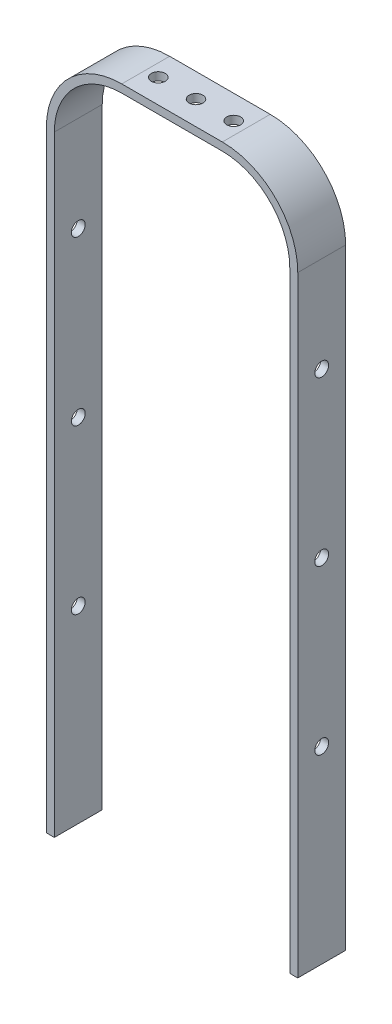
ISO-10303-21;
HEADER;
FILE_DESCRIPTION(('STEP AP214'),'2;1');
FILE_NAME('part.step','',(''),(''),'','','');
FILE_SCHEMA(('AUTOMOTIVE_DESIGN { 1 0 10303 214 1 1 1 1 }'));
ENDSEC;
DATA;
#1=APPLICATION_CONTEXT('core data for automotive mechanical design processes');
#2=APPLICATION_PROTOCOL_DEFINITION('international standard','automotive_design',2000,#1);
#3=PRODUCT_CONTEXT('',#1,'mechanical');
#4=PRODUCT('Part','Part','',(#3));
#5=PRODUCT_RELATED_PRODUCT_CATEGORY('part','',(#4));
#6=PRODUCT_DEFINITION_FORMATION('','',#4);
#7=PRODUCT_DEFINITION_CONTEXT('part definition',#1,'design');
#8=PRODUCT_DEFINITION('design','',#6,#7);
#9=PRODUCT_DEFINITION_SHAPE('','',#8);
#10=(LENGTH_UNIT() NAMED_UNIT(*) SI_UNIT(.MILLI.,.METRE.));
#11=(NAMED_UNIT(*) PLANE_ANGLE_UNIT() SI_UNIT($,.RADIAN.));
#12=(NAMED_UNIT(*) SI_UNIT($,.STERADIAN.) SOLID_ANGLE_UNIT());
#13=UNCERTAINTY_MEASURE_WITH_UNIT(LENGTH_MEASURE(1.E-05),#10,'distance_accuracy_value','');
#14=(GEOMETRIC_REPRESENTATION_CONTEXT(3) GLOBAL_UNCERTAINTY_ASSIGNED_CONTEXT((#13)) GLOBAL_UNIT_ASSIGNED_CONTEXT((#10,
#11,#12)) REPRESENTATION_CONTEXT('',''));
#15=CARTESIAN_POINT('',(0.,0.,0.));
#16=DIRECTION('',(0.,0.,1.));
#17=DIRECTION('',(1.,0.,0.));
#18=AXIS2_PLACEMENT_3D('',#15,#16,#17);
#19=CARTESIAN_POINT('',(46.825,0.,9.525));
#20=DIRECTION('',(0.,1.,0.));
#21=DIRECTION('',(-1.,0.,0.));
#22=AXIS2_PLACEMENT_3D('',#19,#20,#21);
#23=PLANE('',#22);
#24=DIRECTION('',(1.,0.,0.));
#25=VECTOR('',#24,1.);
#26=CARTESIAN_POINT('',(46.825,0.,-9.525));
#27=LINE('',#26,#25);
#28=CARTESIAN_POINT('',(46.825,0.,-9.525));
#29=VERTEX_POINT('',#28);
#30=CARTESIAN_POINT('',(50.,0.,-9.525));
#31=VERTEX_POINT('',#30);
#32=EDGE_CURVE('E157',#29,#31,#27,.T.);
#33=ORIENTED_EDGE('',*,*,#32,.T.);
#34=DIRECTION('',(0.,0.,-1.));
#35=VECTOR('',#34,1.);
#36=CARTESIAN_POINT('',(50.,0.,9.525));
#37=LINE('',#36,#35);
#38=CARTESIAN_POINT('',(50.,0.,9.525));
#39=VERTEX_POINT('',#38);
#40=EDGE_CURVE('E11',#39,#31,#37,.T.);
#41=ORIENTED_EDGE('',*,*,#40,.F.);
#42=DIRECTION('',(1.,0.,0.));
#43=VECTOR('',#42,1.);
#44=CARTESIAN_POINT('',(46.825,0.,9.525));
#45=LINE('',#44,#43);
#46=CARTESIAN_POINT('',(46.825,0.,9.525));
#47=VERTEX_POINT('',#46);
#48=EDGE_CURVE('E180',#47,#39,#45,.T.);
#49=ORIENTED_EDGE('',*,*,#48,.F.);
#50=DIRECTION('',(0.,0.,-1.));
#51=VECTOR('',#50,1.);
#52=CARTESIAN_POINT('',(46.825,0.,9.525));
#53=LINE('',#52,#51);
#54=EDGE_CURVE('E153',#47,#29,#53,.T.);
#55=ORIENTED_EDGE('',*,*,#54,.T.);
#56=EDGE_LOOP('',(#33,#41,#49,#55));
#57=FACE_BOUND('',#56,.T.);
#58=ADVANCED_FACE('F35',(#57),#23,.F.);
#59=CARTESIAN_POINT('',(50.,0.,9.525));
#60=DIRECTION('',(-1.,0.,0.));
#61=DIRECTION('',(0.,0.,1.));
#62=AXIS2_PLACEMENT_3D('',#59,#60,#61);
#63=PLANE('',#62);
#64=CARTESIAN_POINT('',(50.,205.,0.));
#65=DIRECTION('',(-1.,0.,0.));
#66=DIRECTION('',(0.,0.,1.));
#67=AXIS2_PLACEMENT_3D('',#64,#65,#66);
#68=CIRCLE('',#67,2.75);
#69=CARTESIAN_POINT('',(50.,205.,-2.75000000000001));
#70=VERTEX_POINT('',#69);
#71=EDGE_CURVE('E239',#70,#70,#68,.T.);
#72=ORIENTED_EDGE('',*,*,#71,.T.);
#73=EDGE_LOOP('',(#72));
#74=FACE_BOUND('',#73,.T.);
#75=CARTESIAN_POINT('',(50.,140.,0.));
#76=DIRECTION('',(-1.,0.,0.));
#77=DIRECTION('',(0.,0.,1.));
#78=AXIS2_PLACEMENT_3D('',#75,#76,#77);
#79=CIRCLE('',#78,2.75);
#80=CARTESIAN_POINT('',(50.,140.,-2.75000000000001));
#81=VERTEX_POINT('',#80);
#82=EDGE_CURVE('E224',#81,#81,#79,.T.);
#83=ORIENTED_EDGE('',*,*,#82,.T.);
#84=EDGE_LOOP('',(#83));
#85=FACE_BOUND('',#84,.T.);
#86=CARTESIAN_POINT('',(50.,75.,0.));
#87=DIRECTION('',(-1.,0.,0.));
#88=DIRECTION('',(0.,0.,1.));
#89=AXIS2_PLACEMENT_3D('',#86,#87,#88);
#90=CIRCLE('',#89,2.75);
#91=CARTESIAN_POINT('',(50.,75.,-2.75000000000002));
#92=VERTEX_POINT('',#91);
#93=EDGE_CURVE('E220',#92,#92,#90,.T.);
#94=ORIENTED_EDGE('',*,*,#93,.T.);
#95=EDGE_LOOP('',(#94));
#96=FACE_BOUND('',#95,.T.);
#97=DIRECTION('',(0.,1.,0.));
#98=VECTOR('',#97,1.);
#99=CARTESIAN_POINT('',(50.,0.,-9.525));
#100=LINE('',#99,#98);
#101=CARTESIAN_POINT('',(50.,243.,-9.525));
#102=VERTEX_POINT('',#101);
#103=EDGE_CURVE('E160',#31,#102,#100,.T.);
#104=ORIENTED_EDGE('',*,*,#103,.T.);
#105=DIRECTION('',(0.,0.,-1.));
#106=VECTOR('',#105,1.);
#107=CARTESIAN_POINT('',(50.,243.,9.525));
#108=LINE('',#107,#106);
#109=CARTESIAN_POINT('',(50.,243.,9.525));
#110=VERTEX_POINT('',#109);
#111=EDGE_CURVE('E44',#110,#102,#108,.T.);
#112=ORIENTED_EDGE('',*,*,#111,.F.);
#113=DIRECTION('',(0.,1.,0.));
#114=VECTOR('',#113,1.);
#115=CARTESIAN_POINT('',(50.,0.,9.525));
#116=LINE('',#115,#114);
#117=EDGE_CURVE('E108',#39,#110,#116,.T.);
#118=ORIENTED_EDGE('',*,*,#117,.F.);
#119=ORIENTED_EDGE('',*,*,#40,.T.);
#120=EDGE_LOOP('',(#104,#112,#118,#119));
#121=FACE_BOUND('',#120,.T.);
#122=ADVANCED_FACE('F295',(#74,#85,#96,#121),#63,.F.);
#123=CARTESIAN_POINT('',(20.,243.,9.525));
#124=DIRECTION('',(0.,0.,-1.));
#125=DIRECTION('',(-1.,0.,0.));
#126=AXIS2_PLACEMENT_3D('',#123,#124,#125);
#127=CYLINDRICAL_SURFACE('',#126,30.);
#128=CARTESIAN_POINT('',(20.,243.,-9.525));
#129=DIRECTION('',(0.,0.,1.));
#130=DIRECTION('',(1.,0.,0.));
#131=AXIS2_PLACEMENT_3D('',#128,#129,#130);
#132=CIRCLE('',#131,30.);
#133=CARTESIAN_POINT('',(20.,273.,-9.525));
#134=VERTEX_POINT('',#133);
#135=EDGE_CURVE('E163',#102,#134,#132,.T.);
#136=ORIENTED_EDGE('',*,*,#135,.T.);
#137=DIRECTION('',(0.,0.,-1.));
#138=VECTOR('',#137,1.);
#139=CARTESIAN_POINT('',(20.,273.,9.525));
#140=LINE('',#139,#138);
#141=CARTESIAN_POINT('',(20.,273.,9.525));
#142=VERTEX_POINT('',#141);
#143=EDGE_CURVE('E199',#142,#134,#140,.T.);
#144=ORIENTED_EDGE('',*,*,#143,.F.);
#145=CARTESIAN_POINT('',(20.,243.,9.525));
#146=DIRECTION('',(0.,0.,1.));
#147=DIRECTION('',(1.,0.,0.));
#148=AXIS2_PLACEMENT_3D('',#145,#146,#147);
#149=CIRCLE('',#148,30.);
#150=EDGE_CURVE('E252',#110,#142,#149,.T.);
#151=ORIENTED_EDGE('',*,*,#150,.F.);
#152=ORIENTED_EDGE('',*,*,#111,.T.);
#153=EDGE_LOOP('',(#136,#144,#151,#152));
#154=FACE_BOUND('',#153,.T.);
#155=ADVANCED_FACE('F300',(#154),#127,.T.);
#156=CARTESIAN_POINT('',(20.,273.,9.525));
#157=DIRECTION('',(0.,-1.,0.));
#158=DIRECTION('',(0.,0.,-1.));
#159=AXIS2_PLACEMENT_3D('',#156,#157,#158);
#160=PLANE('',#159);
#161=CARTESIAN_POINT('',(15.,273.,0.));
#162=DIRECTION('',(0.,1.,0.));
#163=DIRECTION('',(0.,0.,1.));
#164=AXIS2_PLACEMENT_3D('',#161,#162,#163);
#165=CIRCLE('',#164,2.75);
#166=CARTESIAN_POINT('',(15.,273.,2.75));
#167=VERTEX_POINT('',#166);
#168=EDGE_CURVE('E242',#167,#167,#165,.T.);
#169=ORIENTED_EDGE('',*,*,#168,.F.);
#170=EDGE_LOOP('',(#169));
#171=FACE_BOUND('',#170,.T.);
#172=CARTESIAN_POINT('',(-15.,273.,0.));
#173=DIRECTION('',(0.,1.,0.));
#174=DIRECTION('',(0.,0.,1.));
#175=AXIS2_PLACEMENT_3D('',#172,#173,#174);
#176=CIRCLE('',#175,2.75);
#177=CARTESIAN_POINT('',(-15.,273.,2.75));
#178=VERTEX_POINT('',#177);
#179=EDGE_CURVE('E243',#178,#178,#176,.T.);
#180=ORIENTED_EDGE('',*,*,#179,.F.);
#181=EDGE_LOOP('',(#180));
#182=FACE_BOUND('',#181,.T.);
#183=CARTESIAN_POINT('',(0.,273.,0.));
#184=DIRECTION('',(0.,1.,0.));
#185=DIRECTION('',(0.,0.,1.));
#186=AXIS2_PLACEMENT_3D('',#183,#184,#185);
#187=CIRCLE('',#186,2.75);
#188=CARTESIAN_POINT('',(0.,273.,2.75));
#189=VERTEX_POINT('',#188);
#190=EDGE_CURVE('E208',#189,#189,#187,.T.);
#191=ORIENTED_EDGE('',*,*,#190,.F.);
#192=EDGE_LOOP('',(#191));
#193=FACE_BOUND('',#192,.T.);
#194=DIRECTION('',(-1.,0.,0.));
#195=VECTOR('',#194,1.);
#196=CARTESIAN_POINT('',(20.,273.,-9.525));
#197=LINE('',#196,#195);
#198=CARTESIAN_POINT('',(-20.,273.,-9.525));
#199=VERTEX_POINT('',#198);
#200=EDGE_CURVE('E165',#134,#199,#197,.T.);
#201=ORIENTED_EDGE('',*,*,#200,.T.);
#202=DIRECTION('',(0.,0.,-1.));
#203=VECTOR('',#202,1.);
#204=CARTESIAN_POINT('',(-20.,273.,9.525));
#205=LINE('',#204,#203);
#206=CARTESIAN_POINT('',(-20.,273.,9.525));
#207=VERTEX_POINT('',#206);
#208=EDGE_CURVE('E196',#207,#199,#205,.T.);
#209=ORIENTED_EDGE('',*,*,#208,.F.);
#210=DIRECTION('',(-1.,0.,0.));
#211=VECTOR('',#210,1.);
#212=CARTESIAN_POINT('',(20.,273.,9.525));
#213=LINE('',#212,#211);
#214=EDGE_CURVE('E254',#142,#207,#213,.T.);
#215=ORIENTED_EDGE('',*,*,#214,.F.);
#216=ORIENTED_EDGE('',*,*,#143,.T.);
#217=EDGE_LOOP('',(#201,#209,#215,#216));
#218=FACE_BOUND('',#217,.T.);
#219=ADVANCED_FACE('F306',(#171,#182,#193,#218),#160,.F.);
#220=CARTESIAN_POINT('',(-20.,243.,9.525));
#221=DIRECTION('',(0.,0.,-1.));
#222=DIRECTION('',(-1.,0.,0.));
#223=AXIS2_PLACEMENT_3D('',#220,#221,#222);
#224=CYLINDRICAL_SURFACE('',#223,30.);
#225=CARTESIAN_POINT('',(-20.,243.,-9.525));
#226=DIRECTION('',(0.,0.,1.));
#227=DIRECTION('',(-1.,0.,0.));
#228=AXIS2_PLACEMENT_3D('',#225,#226,#227);
#229=CIRCLE('',#228,30.);
#230=CARTESIAN_POINT('',(-50.,243.,-9.525));
#231=VERTEX_POINT('',#230);
#232=EDGE_CURVE('E167',#199,#231,#229,.T.);
#233=ORIENTED_EDGE('',*,*,#232,.T.);
#234=DIRECTION('',(0.,0.,-1.));
#235=VECTOR('',#234,1.);
#236=CARTESIAN_POINT('',(-50.,243.,9.525));
#237=LINE('',#236,#235);
#238=CARTESIAN_POINT('',(-50.,243.,9.525));
#239=VERTEX_POINT('',#238);
#240=EDGE_CURVE('E193',#239,#231,#237,.T.);
#241=ORIENTED_EDGE('',*,*,#240,.F.);
#242=CARTESIAN_POINT('',(-20.,243.,9.525));
#243=DIRECTION('',(0.,0.,1.));
#244=DIRECTION('',(-1.,0.,0.));
#245=AXIS2_PLACEMENT_3D('',#242,#243,#244);
#246=CIRCLE('',#245,30.);
#247=EDGE_CURVE('E256',#207,#239,#246,.T.);
#248=ORIENTED_EDGE('',*,*,#247,.F.);
#249=ORIENTED_EDGE('',*,*,#208,.T.);
#250=EDGE_LOOP('',(#233,#241,#248,#249));
#251=FACE_BOUND('',#250,.T.);
#252=ADVANCED_FACE('F313',(#251),#224,.T.);
#253=CARTESIAN_POINT('',(-50.,0.,9.525));
#254=DIRECTION('',(1.,0.,0.));
#255=DIRECTION('',(0.,0.,-1.));
#256=AXIS2_PLACEMENT_3D('',#253,#254,#255);
#257=PLANE('',#256);
#258=CARTESIAN_POINT('',(-50.,205.,0.));
#259=DIRECTION('',(1.,0.,0.));
#260=DIRECTION('',(0.,0.,-1.));
#261=AXIS2_PLACEMENT_3D('',#258,#259,#260);
#262=CIRCLE('',#261,2.75);
#263=CARTESIAN_POINT('',(-50.,205.,-2.75000000000001));
#264=VERTEX_POINT('',#263);
#265=EDGE_CURVE('E216',#264,#264,#262,.T.);
#266=ORIENTED_EDGE('',*,*,#265,.T.);
#267=EDGE_LOOP('',(#266));
#268=FACE_BOUND('',#267,.T.);
#269=CARTESIAN_POINT('',(-50.,140.,0.));
#270=DIRECTION('',(1.,0.,0.));
#271=DIRECTION('',(0.,0.,-1.));
#272=AXIS2_PLACEMENT_3D('',#269,#270,#271);
#273=CIRCLE('',#272,2.75);
#274=CARTESIAN_POINT('',(-50.,140.,-2.75000000000001));
#275=VERTEX_POINT('',#274);
#276=EDGE_CURVE('E391',#275,#275,#273,.T.);
#277=ORIENTED_EDGE('',*,*,#276,.T.);
#278=EDGE_LOOP('',(#277));
#279=FACE_BOUND('',#278,.T.);
#280=CARTESIAN_POINT('',(-50.,75.,0.));
#281=DIRECTION('',(1.,0.,0.));
#282=DIRECTION('',(0.,0.,-1.));
#283=AXIS2_PLACEMENT_3D('',#280,#281,#282);
#284=CIRCLE('',#283,2.75);
#285=CARTESIAN_POINT('',(-50.,75.,-2.75000000000002));
#286=VERTEX_POINT('',#285);
#287=EDGE_CURVE('E394',#286,#286,#284,.T.);
#288=ORIENTED_EDGE('',*,*,#287,.T.);
#289=EDGE_LOOP('',(#288));
#290=FACE_BOUND('',#289,.T.);
#291=DIRECTION('',(0.,-1.,0.));
#292=VECTOR('',#291,1.);
#293=CARTESIAN_POINT('',(-50.,0.,-9.525));
#294=LINE('',#293,#292);
#295=CARTESIAN_POINT('',(-50.,0.,-9.525));
#296=VERTEX_POINT('',#295);
#297=EDGE_CURVE('E169',#231,#296,#294,.T.);
#298=ORIENTED_EDGE('',*,*,#297,.T.);
#299=DIRECTION('',(0.,0.,-1.));
#300=VECTOR('',#299,1.);
#301=CARTESIAN_POINT('',(-50.,0.,9.525));
#302=LINE('',#301,#300);
#303=CARTESIAN_POINT('',(-50.,0.,9.525));
#304=VERTEX_POINT('',#303);
#305=EDGE_CURVE('E190',#304,#296,#302,.T.);
#306=ORIENTED_EDGE('',*,*,#305,.F.);
#307=DIRECTION('',(0.,-1.,0.));
#308=VECTOR('',#307,1.);
#309=CARTESIAN_POINT('',(-50.,0.,9.525));
#310=LINE('',#309,#308);
#311=EDGE_CURVE('E258',#239,#304,#310,.T.);
#312=ORIENTED_EDGE('',*,*,#311,.F.);
#313=ORIENTED_EDGE('',*,*,#240,.T.);
#314=EDGE_LOOP('',(#298,#306,#312,#313));
#315=FACE_BOUND('',#314,.T.);
#316=ADVANCED_FACE('F317',(#268,#279,#290,#315),#257,.F.);
#317=CARTESIAN_POINT('',(-46.825,0.,9.525));
#318=DIRECTION('',(0.,1.,0.));
#319=DIRECTION('',(-1.,0.,0.));
#320=AXIS2_PLACEMENT_3D('',#317,#318,#319);
#321=PLANE('',#320);
#322=DIRECTION('',(1.,0.,0.));
#323=VECTOR('',#322,1.);
#324=CARTESIAN_POINT('',(-46.825,0.,-9.525));
#325=LINE('',#324,#323);
#326=CARTESIAN_POINT('',(-46.825,0.,-9.525));
#327=VERTEX_POINT('',#326);
#328=EDGE_CURVE('E171',#296,#327,#325,.T.);
#329=ORIENTED_EDGE('',*,*,#328,.T.);
#330=DIRECTION('',(0.,0.,-1.));
#331=VECTOR('',#330,1.);
#332=CARTESIAN_POINT('',(-46.825,0.,9.525));
#333=LINE('',#332,#331);
#334=CARTESIAN_POINT('',(-46.825,0.,9.525));
#335=VERTEX_POINT('',#334);
#336=EDGE_CURVE('E187',#335,#327,#333,.T.);
#337=ORIENTED_EDGE('',*,*,#336,.F.);
#338=DIRECTION('',(1.,0.,0.));
#339=VECTOR('',#338,1.);
#340=CARTESIAN_POINT('',(-46.825,0.,9.525));
#341=LINE('',#340,#339);
#342=EDGE_CURVE('E260',#304,#335,#341,.T.);
#343=ORIENTED_EDGE('',*,*,#342,.F.);
#344=ORIENTED_EDGE('',*,*,#305,.T.);
#345=EDGE_LOOP('',(#329,#337,#343,#344));
#346=FACE_BOUND('',#345,.T.);
#347=ADVANCED_FACE('F320',(#346),#321,.F.);
#348=CARTESIAN_POINT('',(-46.825,243.,9.525));
#349=DIRECTION('',(-1.,0.,0.));
#350=DIRECTION('',(0.,-1.,0.));
#351=AXIS2_PLACEMENT_3D('',#348,#349,#350);
#352=PLANE('',#351);
#353=CARTESIAN_POINT('',(-46.825,205.,0.));
#354=DIRECTION('',(-1.,0.,0.));
#355=DIRECTION('',(0.,-1.,0.));
#356=AXIS2_PLACEMENT_3D('',#353,#354,#355);
#357=CIRCLE('',#356,2.75);
#358=CARTESIAN_POINT('',(-46.825,202.25,0.));
#359=VERTEX_POINT('',#358);
#360=EDGE_CURVE('E236',#359,#359,#357,.T.);
#361=ORIENTED_EDGE('',*,*,#360,.T.);
#362=EDGE_LOOP('',(#361));
#363=FACE_BOUND('',#362,.T.);
#364=CARTESIAN_POINT('',(-46.825,140.,0.));
#365=DIRECTION('',(-1.,0.,0.));
#366=DIRECTION('',(0.,-1.,0.));
#367=AXIS2_PLACEMENT_3D('',#364,#365,#366);
#368=CIRCLE('',#367,2.75);
#369=CARTESIAN_POINT('',(-46.825,137.25,0.));
#370=VERTEX_POINT('',#369);
#371=EDGE_CURVE('E219',#370,#370,#368,.T.);
#372=ORIENTED_EDGE('',*,*,#371,.T.);
#373=EDGE_LOOP('',(#372));
#374=FACE_BOUND('',#373,.T.);
#375=CARTESIAN_POINT('',(-46.825,75.,0.));
#376=DIRECTION('',(-1.,0.,0.));
#377=DIRECTION('',(0.,-1.,0.));
#378=AXIS2_PLACEMENT_3D('',#375,#376,#377);
#379=CIRCLE('',#378,2.75);
#380=CARTESIAN_POINT('',(-46.825,72.25,0.));
#381=VERTEX_POINT('',#380);
#382=EDGE_CURVE('E215',#381,#381,#379,.T.);
#383=ORIENTED_EDGE('',*,*,#382,.T.);
#384=EDGE_LOOP('',(#383));
#385=FACE_BOUND('',#384,.T.);
#386=DIRECTION('',(0.,1.,0.));
#387=VECTOR('',#386,1.);
#388=CARTESIAN_POINT('',(-46.825,243.,-9.525));
#389=LINE('',#388,#387);
#390=CARTESIAN_POINT('',(-46.825,243.,-9.525));
#391=VERTEX_POINT('',#390);
#392=EDGE_CURVE('E173',#327,#391,#389,.T.);
#393=ORIENTED_EDGE('',*,*,#392,.T.);
#394=DIRECTION('',(0.,0.,-1.));
#395=VECTOR('',#394,1.);
#396=CARTESIAN_POINT('',(-46.825,243.,9.525));
#397=LINE('',#396,#395);
#398=CARTESIAN_POINT('',(-46.825,243.,9.525));
#399=VERTEX_POINT('',#398);
#400=EDGE_CURVE('E184',#399,#391,#397,.T.);
#401=ORIENTED_EDGE('',*,*,#400,.F.);
#402=DIRECTION('',(0.,1.,0.));
#403=VECTOR('',#402,1.);
#404=CARTESIAN_POINT('',(-46.825,243.,9.525));
#405=LINE('',#404,#403);
#406=EDGE_CURVE('E262',#335,#399,#405,.T.);
#407=ORIENTED_EDGE('',*,*,#406,.F.);
#408=ORIENTED_EDGE('',*,*,#336,.T.);
#409=EDGE_LOOP('',(#393,#401,#407,#408));
#410=FACE_BOUND('',#409,.T.);
#411=ADVANCED_FACE('F268',(#363,#374,#385,#410),#352,.F.);
#412=CARTESIAN_POINT('',(-20.,243.,9.525));
#413=DIRECTION('',(0.,0.,-1.));
#414=DIRECTION('',(-1.,0.,0.));
#415=AXIS2_PLACEMENT_3D('',#412,#413,#414);
#416=CYLINDRICAL_SURFACE('',#415,26.825);
#417=CARTESIAN_POINT('',(-20.,243.,-9.525));
#418=DIRECTION('',(0.,0.,-1.));
#419=DIRECTION('',(1.,0.,0.));
#420=AXIS2_PLACEMENT_3D('',#417,#418,#419);
#421=CIRCLE('',#420,26.825);
#422=CARTESIAN_POINT('',(-20.,269.825,-9.525));
#423=VERTEX_POINT('',#422);
#424=EDGE_CURVE('E175',#391,#423,#421,.T.);
#425=ORIENTED_EDGE('',*,*,#424,.T.);
#426=DIRECTION('',(0.,0.,-1.));
#427=VECTOR('',#426,1.);
#428=CARTESIAN_POINT('',(-20.,269.825,9.525));
#429=LINE('',#428,#427);
#430=CARTESIAN_POINT('',(-20.,269.825,9.525));
#431=VERTEX_POINT('',#430);
#432=EDGE_CURVE('E148',#431,#423,#429,.T.);
#433=ORIENTED_EDGE('',*,*,#432,.F.);
#434=CARTESIAN_POINT('',(-20.,243.,9.525));
#435=DIRECTION('',(0.,0.,-1.));
#436=DIRECTION('',(1.,0.,0.));
#437=AXIS2_PLACEMENT_3D('',#434,#435,#436);
#438=CIRCLE('',#437,26.825);
#439=EDGE_CURVE('E139',#399,#431,#438,.T.);
#440=ORIENTED_EDGE('',*,*,#439,.F.);
#441=ORIENTED_EDGE('',*,*,#400,.T.);
#442=EDGE_LOOP('',(#425,#433,#440,#441));
#443=FACE_BOUND('',#442,.T.);
#444=ADVANCED_FACE('F272',(#443),#416,.F.);
#445=CARTESIAN_POINT('',(-20.,269.825,9.525));
#446=DIRECTION('',(0.,1.,0.));
#447=DIRECTION('',(0.,0.,1.));
#448=AXIS2_PLACEMENT_3D('',#445,#446,#447);
#449=PLANE('',#448);
#450=CARTESIAN_POINT('',(15.,269.825,0.));
#451=DIRECTION('',(0.,1.,0.));
#452=DIRECTION('',(0.,0.,1.));
#453=AXIS2_PLACEMENT_3D('',#450,#451,#452);
#454=CIRCLE('',#453,2.75);
#455=CARTESIAN_POINT('',(15.,269.825,2.75));
#456=VERTEX_POINT('',#455);
#457=EDGE_CURVE('E161',#456,#456,#454,.T.);
#458=ORIENTED_EDGE('',*,*,#457,.T.);
#459=EDGE_LOOP('',(#458));
#460=FACE_BOUND('',#459,.T.);
#461=CARTESIAN_POINT('',(-15.,269.825,0.));
#462=DIRECTION('',(0.,1.,0.));
#463=DIRECTION('',(0.,0.,1.));
#464=AXIS2_PLACEMENT_3D('',#461,#462,#463);
#465=CIRCLE('',#464,2.75);
#466=CARTESIAN_POINT('',(-15.,269.825,2.75));
#467=VERTEX_POINT('',#466);
#468=EDGE_CURVE('E207',#467,#467,#465,.T.);
#469=ORIENTED_EDGE('',*,*,#468,.T.);
#470=EDGE_LOOP('',(#469));
#471=FACE_BOUND('',#470,.T.);
#472=CARTESIAN_POINT('',(0.,269.825,0.));
#473=DIRECTION('',(0.,1.,0.));
#474=DIRECTION('',(0.,0.,1.));
#475=AXIS2_PLACEMENT_3D('',#472,#473,#474);
#476=CIRCLE('',#475,2.75);
#477=CARTESIAN_POINT('',(0.,269.825,2.75));
#478=VERTEX_POINT('',#477);
#479=EDGE_CURVE('E204',#478,#478,#476,.T.);
#480=ORIENTED_EDGE('',*,*,#479,.T.);
#481=EDGE_LOOP('',(#480));
#482=FACE_BOUND('',#481,.T.);
#483=DIRECTION('',(1.,0.,0.));
#484=VECTOR('',#483,1.);
#485=CARTESIAN_POINT('',(-20.,269.825,-9.525));
#486=LINE('',#485,#484);
#487=CARTESIAN_POINT('',(20.,269.825,-9.525));
#488=VERTEX_POINT('',#487);
#489=EDGE_CURVE('E147',#423,#488,#486,.T.);
#490=ORIENTED_EDGE('',*,*,#489,.T.);
#491=DIRECTION('',(0.,0.,-1.));
#492=VECTOR('',#491,1.);
#493=CARTESIAN_POINT('',(20.,269.825,9.525));
#494=LINE('',#493,#492);
#495=CARTESIAN_POINT('',(20.,269.825,9.525));
#496=VERTEX_POINT('',#495);
#497=EDGE_CURVE('E144',#496,#488,#494,.T.);
#498=ORIENTED_EDGE('',*,*,#497,.F.);
#499=DIRECTION('',(1.,0.,0.));
#500=VECTOR('',#499,1.);
#501=CARTESIAN_POINT('',(-20.,269.825,9.525));
#502=LINE('',#501,#500);
#503=EDGE_CURVE('E133',#431,#496,#502,.T.);
#504=ORIENTED_EDGE('',*,*,#503,.F.);
#505=ORIENTED_EDGE('',*,*,#432,.T.);
#506=EDGE_LOOP('',(#490,#498,#504,#505));
#507=FACE_BOUND('',#506,.T.);
#508=ADVANCED_FACE('F145',(#460,#471,#482,#507),#449,.F.);
#509=CARTESIAN_POINT('',(20.,243.,9.525));
#510=DIRECTION('',(0.,0.,-1.));
#511=DIRECTION('',(-1.,0.,0.));
#512=AXIS2_PLACEMENT_3D('',#509,#510,#511);
#513=CYLINDRICAL_SURFACE('',#512,26.825);
#514=CARTESIAN_POINT('',(20.,243.,-9.525));
#515=DIRECTION('',(0.,0.,-1.));
#516=DIRECTION('',(-1.,0.,0.));
#517=AXIS2_PLACEMENT_3D('',#514,#515,#516);
#518=CIRCLE('',#517,26.825);
#519=CARTESIAN_POINT('',(46.825,243.,-9.525));
#520=VERTEX_POINT('',#519);
#521=EDGE_CURVE('E94',#488,#520,#518,.T.);
#522=ORIENTED_EDGE('',*,*,#521,.T.);
#523=DIRECTION('',(0.,0.,-1.));
#524=VECTOR('',#523,1.);
#525=CARTESIAN_POINT('',(46.825,243.,9.525));
#526=LINE('',#525,#524);
#527=CARTESIAN_POINT('',(46.825,243.,9.525));
#528=VERTEX_POINT('',#527);
#529=EDGE_CURVE('E149',#528,#520,#526,.T.);
#530=ORIENTED_EDGE('',*,*,#529,.F.);
#531=CARTESIAN_POINT('',(20.,243.,9.525));
#532=DIRECTION('',(0.,0.,-1.));
#533=DIRECTION('',(-1.,0.,0.));
#534=AXIS2_PLACEMENT_3D('',#531,#532,#533);
#535=CIRCLE('',#534,26.825);
#536=EDGE_CURVE('E137',#496,#528,#535,.T.);
#537=ORIENTED_EDGE('',*,*,#536,.F.);
#538=ORIENTED_EDGE('',*,*,#497,.T.);
#539=EDGE_LOOP('',(#522,#530,#537,#538));
#540=FACE_BOUND('',#539,.T.);
#541=ADVANCED_FACE('F151',(#540),#513,.F.);
#542=CARTESIAN_POINT('',(46.825,243.,9.525));
#543=DIRECTION('',(1.,0.,0.));
#544=DIRECTION('',(0.,1.,0.));
#545=AXIS2_PLACEMENT_3D('',#542,#543,#544);
#546=PLANE('',#545);
#547=CARTESIAN_POINT('',(46.825,205.,0.));
#548=DIRECTION('',(1.,0.,0.));
#549=DIRECTION('',(0.,1.,0.));
#550=AXIS2_PLACEMENT_3D('',#547,#548,#549);
#551=CIRCLE('',#550,2.75);
#552=CARTESIAN_POINT('',(46.825,205.,-2.75000000000001));
#553=VERTEX_POINT('',#552);
#554=EDGE_CURVE('E38',#553,#553,#551,.T.);
#555=ORIENTED_EDGE('',*,*,#554,.T.);
#556=EDGE_LOOP('',(#555));
#557=FACE_BOUND('',#556,.T.);
#558=CARTESIAN_POINT('',(46.825,140.,0.));
#559=DIRECTION('',(1.,0.,0.));
#560=DIRECTION('',(0.,1.,0.));
#561=AXIS2_PLACEMENT_3D('',#558,#559,#560);
#562=CIRCLE('',#561,2.75);
#563=CARTESIAN_POINT('',(46.825,140.,-2.75000000000001));
#564=VERTEX_POINT('',#563);
#565=EDGE_CURVE('E217',#564,#564,#562,.T.);
#566=ORIENTED_EDGE('',*,*,#565,.T.);
#567=EDGE_LOOP('',(#566));
#568=FACE_BOUND('',#567,.T.);
#569=CARTESIAN_POINT('',(46.825,75.,0.));
#570=DIRECTION('',(1.,0.,0.));
#571=DIRECTION('',(0.,1.,0.));
#572=AXIS2_PLACEMENT_3D('',#569,#570,#571);
#573=CIRCLE('',#572,2.75);
#574=CARTESIAN_POINT('',(46.825,75.,-2.75000000000002));
#575=VERTEX_POINT('',#574);
#576=EDGE_CURVE('E213',#575,#575,#573,.T.);
#577=ORIENTED_EDGE('',*,*,#576,.T.);
#578=EDGE_LOOP('',(#577));
#579=FACE_BOUND('',#578,.T.);
#580=DIRECTION('',(0.,-1.,0.));
#581=VECTOR('',#580,1.);
#582=CARTESIAN_POINT('',(46.825,243.,-9.525));
#583=LINE('',#582,#581);
#584=EDGE_CURVE('E100',#520,#29,#583,.T.);
#585=ORIENTED_EDGE('',*,*,#584,.T.);
#586=ORIENTED_EDGE('',*,*,#54,.F.);
#587=DIRECTION('',(0.,-1.,0.));
#588=VECTOR('',#587,1.);
#589=CARTESIAN_POINT('',(46.825,243.,9.525));
#590=LINE('',#589,#588);
#591=EDGE_CURVE('E53',#528,#47,#590,.T.);
#592=ORIENTED_EDGE('',*,*,#591,.F.);
#593=ORIENTED_EDGE('',*,*,#529,.T.);
#594=EDGE_LOOP('',(#585,#586,#592,#593));
#595=FACE_BOUND('',#594,.T.);
#596=ADVANCED_FACE('F280',(#557,#568,#579,#595),#546,.F.);
#597=CARTESIAN_POINT('',(20.,243.,9.525));
#598=DIRECTION('',(0.,0.,1.));
#599=DIRECTION('',(1.,0.,0.));
#600=AXIS2_PLACEMENT_3D('',#597,#598,#599);
#601=PLANE('',#600);
#602=ORIENTED_EDGE('',*,*,#48,.T.);
#603=ORIENTED_EDGE('',*,*,#117,.T.);
#604=ORIENTED_EDGE('',*,*,#150,.T.);
#605=ORIENTED_EDGE('',*,*,#214,.T.);
#606=ORIENTED_EDGE('',*,*,#247,.T.);
#607=ORIENTED_EDGE('',*,*,#311,.T.);
#608=ORIENTED_EDGE('',*,*,#342,.T.);
#609=ORIENTED_EDGE('',*,*,#406,.T.);
#610=ORIENTED_EDGE('',*,*,#439,.T.);
#611=ORIENTED_EDGE('',*,*,#503,.T.);
#612=ORIENTED_EDGE('',*,*,#536,.T.);
#613=ORIENTED_EDGE('',*,*,#591,.T.);
#614=EDGE_LOOP('',(#602,#603,#604,#605,#606,#607,#608,#609,#610,#611,#612,#613));
#615=FACE_BOUND('',#614,.T.);
#616=ADVANCED_FACE('F135',(#615),#601,.T.);
#617=CARTESIAN_POINT('',(20.,243.,-9.525));
#618=DIRECTION('',(0.,0.,1.));
#619=DIRECTION('',(1.,0.,0.));
#620=AXIS2_PLACEMENT_3D('',#617,#618,#619);
#621=PLANE('',#620);
#622=ORIENTED_EDGE('',*,*,#32,.F.);
#623=ORIENTED_EDGE('',*,*,#584,.F.);
#624=ORIENTED_EDGE('',*,*,#521,.F.);
#625=ORIENTED_EDGE('',*,*,#489,.F.);
#626=ORIENTED_EDGE('',*,*,#424,.F.);
#627=ORIENTED_EDGE('',*,*,#392,.F.);
#628=ORIENTED_EDGE('',*,*,#328,.F.);
#629=ORIENTED_EDGE('',*,*,#297,.F.);
#630=ORIENTED_EDGE('',*,*,#232,.F.);
#631=ORIENTED_EDGE('',*,*,#200,.F.);
#632=ORIENTED_EDGE('',*,*,#135,.F.);
#633=ORIENTED_EDGE('',*,*,#103,.F.);
#634=EDGE_LOOP('',(#622,#623,#624,#625,#626,#627,#628,#629,#630,#631,#632,#633));
#635=FACE_BOUND('',#634,.T.);
#636=ADVANCED_FACE('F275',(#635),#621,.F.);
#637=CARTESIAN_POINT('',(0.,0.,0.));
#638=DIRECTION('',(0.,1.,0.));
#639=DIRECTION('',(0.,0.,1.));
#640=AXIS2_PLACEMENT_3D('',#637,#638,#639);
#641=CYLINDRICAL_SURFACE('',#640,2.75);
#642=ORIENTED_EDGE('',*,*,#190,.T.);
#643=EDGE_LOOP('',(#642));
#644=FACE_BOUND('',#643,.T.);
#645=ORIENTED_EDGE('',*,*,#479,.F.);
#646=EDGE_LOOP('',(#645));
#647=FACE_BOUND('',#646,.T.);
#648=ADVANCED_FACE('F339',(#644,#647),#641,.F.);
#649=CARTESIAN_POINT('',(-15.,0.,0.));
#650=DIRECTION('',(0.,1.,0.));
#651=DIRECTION('',(0.,0.,1.));
#652=AXIS2_PLACEMENT_3D('',#649,#650,#651);
#653=CYLINDRICAL_SURFACE('',#652,2.75);
#654=ORIENTED_EDGE('',*,*,#179,.T.);
#655=EDGE_LOOP('',(#654));
#656=FACE_BOUND('',#655,.T.);
#657=ORIENTED_EDGE('',*,*,#468,.F.);
#658=EDGE_LOOP('',(#657));
#659=FACE_BOUND('',#658,.T.);
#660=ADVANCED_FACE('F341',(#656,#659),#653,.F.);
#661=CARTESIAN_POINT('',(15.,0.,0.));
#662=DIRECTION('',(0.,1.,0.));
#663=DIRECTION('',(0.,0.,1.));
#664=AXIS2_PLACEMENT_3D('',#661,#662,#663);
#665=CYLINDRICAL_SURFACE('',#664,2.75);
#666=ORIENTED_EDGE('',*,*,#168,.T.);
#667=EDGE_LOOP('',(#666));
#668=FACE_BOUND('',#667,.T.);
#669=ORIENTED_EDGE('',*,*,#457,.F.);
#670=EDGE_LOOP('',(#669));
#671=FACE_BOUND('',#670,.T.);
#672=ADVANCED_FACE('F348',(#668,#671),#665,.F.);
#673=CARTESIAN_POINT('',(-50.,75.,0.));
#674=DIRECTION('',(1.,0.,0.));
#675=DIRECTION('',(0.,0.,-1.));
#676=AXIS2_PLACEMENT_3D('',#673,#674,#675);
#677=CYLINDRICAL_SURFACE('',#676,2.75);
#678=CARTESIAN_POINT('',(46.825,75.,-2.75000000000002));
#679=CARTESIAN_POINT('',(46.8580729166667,75.,-2.75000000000002));
#680=CARTESIAN_POINT('',(46.8911458333334,75.,-2.75000000000002));
#681=CARTESIAN_POINT('',(46.9572916666667,75.,-2.75000000000002));
#682=CARTESIAN_POINT('',(46.9903645833334,75.,-2.75000000000002));
#683=CARTESIAN_POINT('',(47.0565104166667,75.,-2.75000000000002));
#684=CARTESIAN_POINT('',(47.0895833333334,75.,-2.75000000000002));
#685=CARTESIAN_POINT('',(47.1557291666667,75.,-2.75000000000002));
#686=CARTESIAN_POINT('',(47.1888020833333,75.,-2.75000000000002));
#687=CARTESIAN_POINT('',(47.2549479166667,75.,-2.75000000000002));
#688=CARTESIAN_POINT('',(47.2880208333333,75.,-2.75000000000002));
#689=CARTESIAN_POINT('',(47.3541666666667,75.,-2.75000000000002));
#690=CARTESIAN_POINT('',(47.3872395833334,75.,-2.75000000000002));
#691=CARTESIAN_POINT('',(47.4533854166667,75.,-2.75000000000002));
#692=CARTESIAN_POINT('',(47.4864583333334,75.,-2.75000000000002));
#693=CARTESIAN_POINT('',(47.5526041666667,75.,-2.75000000000002));
#694=CARTESIAN_POINT('',(47.5856770833333,75.,-2.75000000000002));
#695=CARTESIAN_POINT('',(47.6518229166667,75.,-2.75000000000002));
#696=CARTESIAN_POINT('',(47.6848958333333,75.,-2.75000000000002));
#697=CARTESIAN_POINT('',(47.7510416666667,75.,-2.75000000000002));
#698=CARTESIAN_POINT('',(47.7841145833333,75.,-2.75000000000002));
#699=CARTESIAN_POINT('',(47.8502604166667,75.,-2.75000000000002));
#700=CARTESIAN_POINT('',(47.8833333333333,75.,-2.75000000000002));
#701=CARTESIAN_POINT('',(47.9494791666667,75.,-2.75000000000002));
#702=CARTESIAN_POINT('',(47.9825520833334,75.,-2.75000000000002));
#703=CARTESIAN_POINT('',(48.0486979166667,75.,-2.75000000000002));
#704=CARTESIAN_POINT('',(48.0817708333334,75.,-2.75000000000002));
#705=CARTESIAN_POINT('',(48.1479166666667,75.,-2.75000000000002));
#706=CARTESIAN_POINT('',(48.1809895833333,75.,-2.75000000000002));
#707=CARTESIAN_POINT('',(48.2471354166667,75.,-2.75000000000002));
#708=CARTESIAN_POINT('',(48.2802083333333,75.,-2.75000000000002));
#709=CARTESIAN_POINT('',(48.3463541666667,75.,-2.75000000000002));
#710=CARTESIAN_POINT('',(48.3794270833333,75.,-2.75000000000002));
#711=CARTESIAN_POINT('',(48.4455729166667,75.,-2.75000000000002));
#712=CARTESIAN_POINT('',(48.4786458333333,75.,-2.75000000000002));
#713=CARTESIAN_POINT('',(48.5447916666667,75.,-2.75000000000002));
#714=CARTESIAN_POINT('',(48.5778645833333,75.,-2.75000000000002));
#715=CARTESIAN_POINT('',(48.6440104166667,75.,-2.75000000000002));
#716=CARTESIAN_POINT('',(48.6770833333333,75.,-2.75000000000002));
#717=CARTESIAN_POINT('',(48.7432291666667,75.,-2.75000000000002));
#718=CARTESIAN_POINT('',(48.7763020833333,75.,-2.75000000000002));
#719=CARTESIAN_POINT('',(48.8424479166667,75.,-2.75000000000002));
#720=CARTESIAN_POINT('',(48.8755208333333,75.,-2.75000000000002));
#721=CARTESIAN_POINT('',(48.9416666666667,75.,-2.75000000000002));
#722=CARTESIAN_POINT('',(48.9747395833333,75.,-2.75000000000002));
#723=CARTESIAN_POINT('',(49.0408854166667,75.,-2.75000000000002));
#724=CARTESIAN_POINT('',(49.0739583333333,75.,-2.75000000000002));
#725=CARTESIAN_POINT('',(49.1401041666667,75.,-2.75000000000002));
#726=CARTESIAN_POINT('',(49.1731770833333,75.,-2.75000000000002));
#727=CARTESIAN_POINT('',(49.2393229166667,75.,-2.75000000000002));
#728=CARTESIAN_POINT('',(49.2723958333333,75.,-2.75000000000002));
#729=CARTESIAN_POINT('',(49.3385416666667,75.,-2.75000000000002));
#730=CARTESIAN_POINT('',(49.3716145833333,75.,-2.75000000000002));
#731=CARTESIAN_POINT('',(49.4377604166667,75.,-2.75000000000002));
#732=CARTESIAN_POINT('',(49.4708333333333,75.,-2.75000000000002));
#733=CARTESIAN_POINT('',(49.5369791666667,75.,-2.75000000000002));
#734=CARTESIAN_POINT('',(49.5700520833333,75.,-2.75000000000002));
#735=CARTESIAN_POINT('',(49.6361979166667,75.,-2.75000000000002));
#736=CARTESIAN_POINT('',(49.6692708333333,75.,-2.75000000000002));
#737=CARTESIAN_POINT('',(49.7354166666667,75.,-2.75000000000002));
#738=CARTESIAN_POINT('',(49.7684895833333,75.,-2.75000000000002));
#739=CARTESIAN_POINT('',(49.8346354166667,75.,-2.75000000000002));
#740=CARTESIAN_POINT('',(49.8677083333333,75.,-2.75000000000002));
#741=CARTESIAN_POINT('',(49.9338541666667,75.,-2.75000000000002));
#742=CARTESIAN_POINT('',(49.9669270833333,75.,-2.75000000000002));
#743=CARTESIAN_POINT('',(50.,75.,-2.75000000000002));
#744=B_SPLINE_CURVE_WITH_KNOTS('',3,(#678,#679,#680,#681,#682,#683,#684,#685,#686,#687,#688,
#689,#690,#691,#692,#693,#694,#695,#696,#697,#698,#699,#700,#701,#702,#703,#704,#705,#706,#707,
#708,#709,#710,#711,#712,#713,#714,#715,#716,#717,#718,#719,#720,#721,#722,#723,#724,#725,#726,
#727,#728,#729,#730,#731,#732,#733,#734,#735,#736,#737,#738,#739,#740,#741,#742,#743),
.UNSPECIFIED.,.F.,.F.,(4,2,2,2,2,2,2,2,2,2,2,2,2,2,2,2,2,2,2,2,2,2,2,2,2,2,2,2,2,2,2,2,4),(0.,
0.0992187500000047,0.198437499999995,0.29765625,0.396874999999991,0.496093749999996,0.5953125,
0.694531249999991,0.793749999999996,0.892968750000001,0.992187499999991,1.09140625,1.190625,
1.28984374999999,1.3890625,1.48828124999999,1.58749999999999,1.68671875,1.78593749999999,
1.88515624999999,1.98437499999998,2.08359374999999,2.18281249999999,2.28203124999998,
2.38124999999999,2.48046874999999,2.57968749999998,2.67890624999999,2.77812499999999,
2.87734374999998,2.97656249999999,3.07578124999998,3.17499999999998),.UNSPECIFIED.);
#745=EDGE_CURVE('BSEAM353',#575,#92,#744,.T.);
#746=ORIENTED_EDGE('',*,*,#576,.F.);
#747=ORIENTED_EDGE('',*,*,#93,.F.);
#748=ORIENTED_EDGE('',*,*,#745,.T.);
#749=ORIENTED_EDGE('',*,*,#745,.F.);
#750=EDGE_LOOP('',(#746,#748,#747,#749));
#751=FACE_BOUND('',#750,.T.);
#752=ADVANCED_FACE('F353',(#751),#677,.F.);
#753=CARTESIAN_POINT('',(-50.,140.,0.));
#754=DIRECTION('',(1.,0.,0.));
#755=DIRECTION('',(0.,0.,-1.));
#756=AXIS2_PLACEMENT_3D('',#753,#754,#755);
#757=CYLINDRICAL_SURFACE('',#756,2.75);
#758=CARTESIAN_POINT('',(46.825,140.,-2.75000000000001));
#759=CARTESIAN_POINT('',(46.8580729166667,140.,-2.75000000000001));
#760=CARTESIAN_POINT('',(46.8911458333334,140.,-2.75000000000001));
#761=CARTESIAN_POINT('',(46.9572916666667,140.,-2.75000000000001));
#762=CARTESIAN_POINT('',(46.9903645833334,140.,-2.75000000000001));
#763=CARTESIAN_POINT('',(47.0565104166667,140.,-2.75000000000001));
#764=CARTESIAN_POINT('',(47.0895833333334,140.,-2.75000000000001));
#765=CARTESIAN_POINT('',(47.1557291666667,140.,-2.75000000000001));
#766=CARTESIAN_POINT('',(47.1888020833333,140.,-2.75000000000001));
#767=CARTESIAN_POINT('',(47.2549479166667,140.,-2.75000000000001));
#768=CARTESIAN_POINT('',(47.2880208333333,140.,-2.75000000000001));
#769=CARTESIAN_POINT('',(47.3541666666667,140.,-2.75000000000001));
#770=CARTESIAN_POINT('',(47.3872395833334,140.,-2.75000000000001));
#771=CARTESIAN_POINT('',(47.4533854166667,140.,-2.75000000000001));
#772=CARTESIAN_POINT('',(47.4864583333334,140.,-2.75000000000001));
#773=CARTESIAN_POINT('',(47.5526041666667,140.,-2.75000000000001));
#774=CARTESIAN_POINT('',(47.5856770833333,140.,-2.75000000000001));
#775=CARTESIAN_POINT('',(47.6518229166667,140.,-2.75000000000001));
#776=CARTESIAN_POINT('',(47.6848958333333,140.,-2.75000000000001));
#777=CARTESIAN_POINT('',(47.7510416666667,140.,-2.75000000000001));
#778=CARTESIAN_POINT('',(47.7841145833333,140.,-2.75000000000001));
#779=CARTESIAN_POINT('',(47.8502604166667,140.,-2.75000000000001));
#780=CARTESIAN_POINT('',(47.8833333333333,140.,-2.75000000000001));
#781=CARTESIAN_POINT('',(47.9494791666667,140.,-2.75000000000001));
#782=CARTESIAN_POINT('',(47.9825520833334,140.,-2.75000000000001));
#783=CARTESIAN_POINT('',(48.0486979166667,140.,-2.75000000000001));
#784=CARTESIAN_POINT('',(48.0817708333334,140.,-2.75000000000001));
#785=CARTESIAN_POINT('',(48.1479166666667,140.,-2.75000000000001));
#786=CARTESIAN_POINT('',(48.1809895833333,140.,-2.75000000000001));
#787=CARTESIAN_POINT('',(48.2471354166667,140.,-2.75000000000001));
#788=CARTESIAN_POINT('',(48.2802083333333,140.,-2.75000000000001));
#789=CARTESIAN_POINT('',(48.3463541666667,140.,-2.75000000000001));
#790=CARTESIAN_POINT('',(48.3794270833333,140.,-2.75000000000001));
#791=CARTESIAN_POINT('',(48.4455729166667,140.,-2.75000000000001));
#792=CARTESIAN_POINT('',(48.4786458333333,140.,-2.75000000000001));
#793=CARTESIAN_POINT('',(48.5447916666667,140.,-2.75000000000001));
#794=CARTESIAN_POINT('',(48.5778645833333,140.,-2.75000000000001));
#795=CARTESIAN_POINT('',(48.6440104166667,140.,-2.75000000000001));
#796=CARTESIAN_POINT('',(48.6770833333333,140.,-2.75000000000001));
#797=CARTESIAN_POINT('',(48.7432291666667,140.,-2.75000000000001));
#798=CARTESIAN_POINT('',(48.7763020833333,140.,-2.75000000000001));
#799=CARTESIAN_POINT('',(48.8424479166667,140.,-2.75000000000001));
#800=CARTESIAN_POINT('',(48.8755208333333,140.,-2.75000000000001));
#801=CARTESIAN_POINT('',(48.9416666666667,140.,-2.75000000000001));
#802=CARTESIAN_POINT('',(48.9747395833333,140.,-2.75000000000001));
#803=CARTESIAN_POINT('',(49.0408854166667,140.,-2.75000000000001));
#804=CARTESIAN_POINT('',(49.0739583333333,140.,-2.75000000000001));
#805=CARTESIAN_POINT('',(49.1401041666667,140.,-2.75000000000001));
#806=CARTESIAN_POINT('',(49.1731770833333,140.,-2.75000000000001));
#807=CARTESIAN_POINT('',(49.2393229166667,140.,-2.75000000000001));
#808=CARTESIAN_POINT('',(49.2723958333333,140.,-2.75000000000001));
#809=CARTESIAN_POINT('',(49.3385416666667,140.,-2.75000000000001));
#810=CARTESIAN_POINT('',(49.3716145833333,140.,-2.75000000000001));
#811=CARTESIAN_POINT('',(49.4377604166667,140.,-2.75000000000001));
#812=CARTESIAN_POINT('',(49.4708333333333,140.,-2.75000000000001));
#813=CARTESIAN_POINT('',(49.5369791666667,140.,-2.75000000000001));
#814=CARTESIAN_POINT('',(49.5700520833333,140.,-2.75000000000001));
#815=CARTESIAN_POINT('',(49.6361979166667,140.,-2.75000000000001));
#816=CARTESIAN_POINT('',(49.6692708333333,140.,-2.75000000000001));
#817=CARTESIAN_POINT('',(49.7354166666667,140.,-2.75000000000001));
#818=CARTESIAN_POINT('',(49.7684895833333,140.,-2.75000000000001));
#819=CARTESIAN_POINT('',(49.8346354166667,140.,-2.75000000000001));
#820=CARTESIAN_POINT('',(49.8677083333333,140.,-2.75000000000001));
#821=CARTESIAN_POINT('',(49.9338541666667,140.,-2.75000000000001));
#822=CARTESIAN_POINT('',(49.9669270833333,140.,-2.75000000000001));
#823=CARTESIAN_POINT('',(50.,140.,-2.75000000000001));
#824=B_SPLINE_CURVE_WITH_KNOTS('',3,(#758,#759,#760,#761,#762,#763,#764,#765,#766,#767,#768,
#769,#770,#771,#772,#773,#774,#775,#776,#777,#778,#779,#780,#781,#782,#783,#784,#785,#786,#787,
#788,#789,#790,#791,#792,#793,#794,#795,#796,#797,#798,#799,#800,#801,#802,#803,#804,#805,#806,
#807,#808,#809,#810,#811,#812,#813,#814,#815,#816,#817,#818,#819,#820,#821,#822,#823),
.UNSPECIFIED.,.F.,.F.,(4,2,2,2,2,2,2,2,2,2,2,2,2,2,2,2,2,2,2,2,2,2,2,2,2,2,2,2,2,2,2,2,4),(0.,
0.0992187500000047,0.198437499999995,0.29765625,0.396874999999991,0.496093749999996,0.5953125,
0.694531249999991,0.793749999999996,0.892968750000001,0.992187499999991,1.09140625,1.190625,
1.28984374999999,1.3890625,1.48828124999999,1.58749999999999,1.68671875,1.78593749999999,
1.88515624999999,1.98437499999998,2.08359374999999,2.18281249999999,2.28203124999998,
2.38124999999999,2.48046874999999,2.57968749999998,2.67890624999999,2.77812499999999,
2.87734374999998,2.97656249999999,3.07578124999998,3.17499999999998),.UNSPECIFIED.);
#825=EDGE_CURVE('BSEAM358',#564,#81,#824,.T.);
#826=ORIENTED_EDGE('',*,*,#565,.F.);
#827=ORIENTED_EDGE('',*,*,#82,.F.);
#828=ORIENTED_EDGE('',*,*,#825,.T.);
#829=ORIENTED_EDGE('',*,*,#825,.F.);
#830=EDGE_LOOP('',(#826,#828,#827,#829));
#831=FACE_BOUND('',#830,.T.);
#832=ADVANCED_FACE('F358',(#831),#757,.F.);
#833=CARTESIAN_POINT('',(-50.,205.,0.));
#834=DIRECTION('',(1.,0.,0.));
#835=DIRECTION('',(0.,0.,-1.));
#836=AXIS2_PLACEMENT_3D('',#833,#834,#835);
#837=CYLINDRICAL_SURFACE('',#836,2.75);
#838=CARTESIAN_POINT('',(46.825,205.,-2.75000000000001));
#839=CARTESIAN_POINT('',(46.8580729166667,205.,-2.75000000000001));
#840=CARTESIAN_POINT('',(46.8911458333334,205.,-2.75000000000001));
#841=CARTESIAN_POINT('',(46.9572916666667,205.,-2.75000000000001));
#842=CARTESIAN_POINT('',(46.9903645833334,205.,-2.75000000000001));
#843=CARTESIAN_POINT('',(47.0565104166667,205.,-2.75000000000001));
#844=CARTESIAN_POINT('',(47.0895833333334,205.,-2.75000000000001));
#845=CARTESIAN_POINT('',(47.1557291666667,205.,-2.75000000000001));
#846=CARTESIAN_POINT('',(47.1888020833333,205.,-2.75000000000001));
#847=CARTESIAN_POINT('',(47.2549479166667,205.,-2.75000000000001));
#848=CARTESIAN_POINT('',(47.2880208333333,205.,-2.75000000000001));
#849=CARTESIAN_POINT('',(47.3541666666667,205.,-2.75000000000001));
#850=CARTESIAN_POINT('',(47.3872395833334,205.,-2.75000000000001));
#851=CARTESIAN_POINT('',(47.4533854166667,205.,-2.75000000000001));
#852=CARTESIAN_POINT('',(47.4864583333334,205.,-2.75000000000001));
#853=CARTESIAN_POINT('',(47.5526041666667,205.,-2.75000000000001));
#854=CARTESIAN_POINT('',(47.5856770833333,205.,-2.75000000000001));
#855=CARTESIAN_POINT('',(47.6518229166667,205.,-2.75000000000001));
#856=CARTESIAN_POINT('',(47.6848958333333,205.,-2.75000000000001));
#857=CARTESIAN_POINT('',(47.7510416666667,205.,-2.75000000000001));
#858=CARTESIAN_POINT('',(47.7841145833333,205.,-2.75000000000001));
#859=CARTESIAN_POINT('',(47.8502604166667,205.,-2.75000000000001));
#860=CARTESIAN_POINT('',(47.8833333333333,205.,-2.75000000000001));
#861=CARTESIAN_POINT('',(47.9494791666667,205.,-2.75000000000001));
#862=CARTESIAN_POINT('',(47.9825520833334,205.,-2.75000000000001));
#863=CARTESIAN_POINT('',(48.0486979166667,205.,-2.75000000000001));
#864=CARTESIAN_POINT('',(48.0817708333334,205.,-2.75000000000001));
#865=CARTESIAN_POINT('',(48.1479166666667,205.,-2.75000000000001));
#866=CARTESIAN_POINT('',(48.1809895833333,205.,-2.75000000000001));
#867=CARTESIAN_POINT('',(48.2471354166667,205.,-2.75000000000001));
#868=CARTESIAN_POINT('',(48.2802083333333,205.,-2.75000000000001));
#869=CARTESIAN_POINT('',(48.3463541666667,205.,-2.75000000000001));
#870=CARTESIAN_POINT('',(48.3794270833333,205.,-2.75000000000001));
#871=CARTESIAN_POINT('',(48.4455729166667,205.,-2.75000000000001));
#872=CARTESIAN_POINT('',(48.4786458333333,205.,-2.75000000000001));
#873=CARTESIAN_POINT('',(48.5447916666667,205.,-2.75000000000001));
#874=CARTESIAN_POINT('',(48.5778645833333,205.,-2.75000000000001));
#875=CARTESIAN_POINT('',(48.6440104166667,205.,-2.75000000000001));
#876=CARTESIAN_POINT('',(48.6770833333333,205.,-2.75000000000001));
#877=CARTESIAN_POINT('',(48.7432291666667,205.,-2.75000000000001));
#878=CARTESIAN_POINT('',(48.7763020833333,205.,-2.75000000000001));
#879=CARTESIAN_POINT('',(48.8424479166667,205.,-2.75000000000001));
#880=CARTESIAN_POINT('',(48.8755208333333,205.,-2.75000000000001));
#881=CARTESIAN_POINT('',(48.9416666666667,205.,-2.75000000000001));
#882=CARTESIAN_POINT('',(48.9747395833333,205.,-2.75000000000001));
#883=CARTESIAN_POINT('',(49.0408854166667,205.,-2.75000000000001));
#884=CARTESIAN_POINT('',(49.0739583333333,205.,-2.75000000000001));
#885=CARTESIAN_POINT('',(49.1401041666667,205.,-2.75000000000001));
#886=CARTESIAN_POINT('',(49.1731770833333,205.,-2.75000000000001));
#887=CARTESIAN_POINT('',(49.2393229166667,205.,-2.75000000000001));
#888=CARTESIAN_POINT('',(49.2723958333333,205.,-2.75000000000001));
#889=CARTESIAN_POINT('',(49.3385416666667,205.,-2.75000000000001));
#890=CARTESIAN_POINT('',(49.3716145833333,205.,-2.75000000000001));
#891=CARTESIAN_POINT('',(49.4377604166667,205.,-2.75000000000001));
#892=CARTESIAN_POINT('',(49.4708333333333,205.,-2.75000000000001));
#893=CARTESIAN_POINT('',(49.5369791666667,205.,-2.75000000000001));
#894=CARTESIAN_POINT('',(49.5700520833333,205.,-2.75000000000001));
#895=CARTESIAN_POINT('',(49.6361979166667,205.,-2.75000000000001));
#896=CARTESIAN_POINT('',(49.6692708333333,205.,-2.75000000000001));
#897=CARTESIAN_POINT('',(49.7354166666667,205.,-2.75000000000001));
#898=CARTESIAN_POINT('',(49.7684895833333,205.,-2.75000000000001));
#899=CARTESIAN_POINT('',(49.8346354166667,205.,-2.75000000000001));
#900=CARTESIAN_POINT('',(49.8677083333333,205.,-2.75000000000001));
#901=CARTESIAN_POINT('',(49.9338541666667,205.,-2.75000000000001));
#902=CARTESIAN_POINT('',(49.9669270833333,205.,-2.75000000000001));
#903=CARTESIAN_POINT('',(50.,205.,-2.75000000000001));
#904=B_SPLINE_CURVE_WITH_KNOTS('',3,(#838,#839,#840,#841,#842,#843,#844,#845,#846,#847,#848,
#849,#850,#851,#852,#853,#854,#855,#856,#857,#858,#859,#860,#861,#862,#863,#864,#865,#866,#867,
#868,#869,#870,#871,#872,#873,#874,#875,#876,#877,#878,#879,#880,#881,#882,#883,#884,#885,#886,
#887,#888,#889,#890,#891,#892,#893,#894,#895,#896,#897,#898,#899,#900,#901,#902,#903),
.UNSPECIFIED.,.F.,.F.,(4,2,2,2,2,2,2,2,2,2,2,2,2,2,2,2,2,2,2,2,2,2,2,2,2,2,2,2,2,2,2,2,4),(0.,
0.0992187500000047,0.198437499999995,0.29765625,0.396874999999991,0.496093749999996,0.5953125,
0.694531249999991,0.793749999999996,0.892968750000001,0.992187499999991,1.09140625,1.190625,
1.28984374999999,1.3890625,1.48828124999999,1.58749999999999,1.68671875,1.78593749999999,
1.88515624999999,1.98437499999998,2.08359374999999,2.18281249999999,2.28203124999998,
2.38124999999999,2.48046874999999,2.57968749999998,2.67890624999999,2.77812499999999,
2.87734374999998,2.97656249999999,3.07578124999998,3.17499999999998),.UNSPECIFIED.);
#905=EDGE_CURVE('BSEAM363',#553,#70,#904,.T.);
#906=ORIENTED_EDGE('',*,*,#554,.F.);
#907=ORIENTED_EDGE('',*,*,#71,.F.);
#908=ORIENTED_EDGE('',*,*,#905,.T.);
#909=ORIENTED_EDGE('',*,*,#905,.F.);
#910=EDGE_LOOP('',(#906,#908,#907,#909));
#911=FACE_BOUND('',#910,.T.);
#912=ADVANCED_FACE('F363',(#911),#837,.F.);
#913=ORIENTED_EDGE('',*,*,#287,.F.);
#914=EDGE_LOOP('',(#913));
#915=FACE_BOUND('',#914,.T.);
#916=ORIENTED_EDGE('',*,*,#382,.F.);
#917=EDGE_LOOP('',(#916));
#918=FACE_BOUND('',#917,.T.);
#919=ADVANCED_FACE('F360',(#915,#918),#677,.F.);
#920=ORIENTED_EDGE('',*,*,#276,.F.);
#921=EDGE_LOOP('',(#920));
#922=FACE_BOUND('',#921,.T.);
#923=ORIENTED_EDGE('',*,*,#371,.F.);
#924=EDGE_LOOP('',(#923));
#925=FACE_BOUND('',#924,.T.);
#926=ADVANCED_FACE('F365',(#922,#925),#757,.F.);
#927=ORIENTED_EDGE('',*,*,#265,.F.);
#928=EDGE_LOOP('',(#927));
#929=FACE_BOUND('',#928,.T.);
#930=ORIENTED_EDGE('',*,*,#360,.F.);
#931=EDGE_LOOP('',(#930));
#932=FACE_BOUND('',#931,.T.);
#933=ADVANCED_FACE('F368',(#929,#932),#837,.F.);
#934=CLOSED_SHELL('',(#58,#122,#155,#219,#252,#316,#347,#411,#444,#508,#541,#596,#616,#636,#648,
#660,#672,#752,#832,#912,#919,#926,#933));
#935=MANIFOLD_SOLID_BREP('B2',#934);
#936=ADVANCED_BREP_SHAPE_REPRESENTATION('',(#18,#935),#14);
#937=SHAPE_DEFINITION_REPRESENTATION(#9,#936);
ENDSEC;
END-ISO-10303-21;
